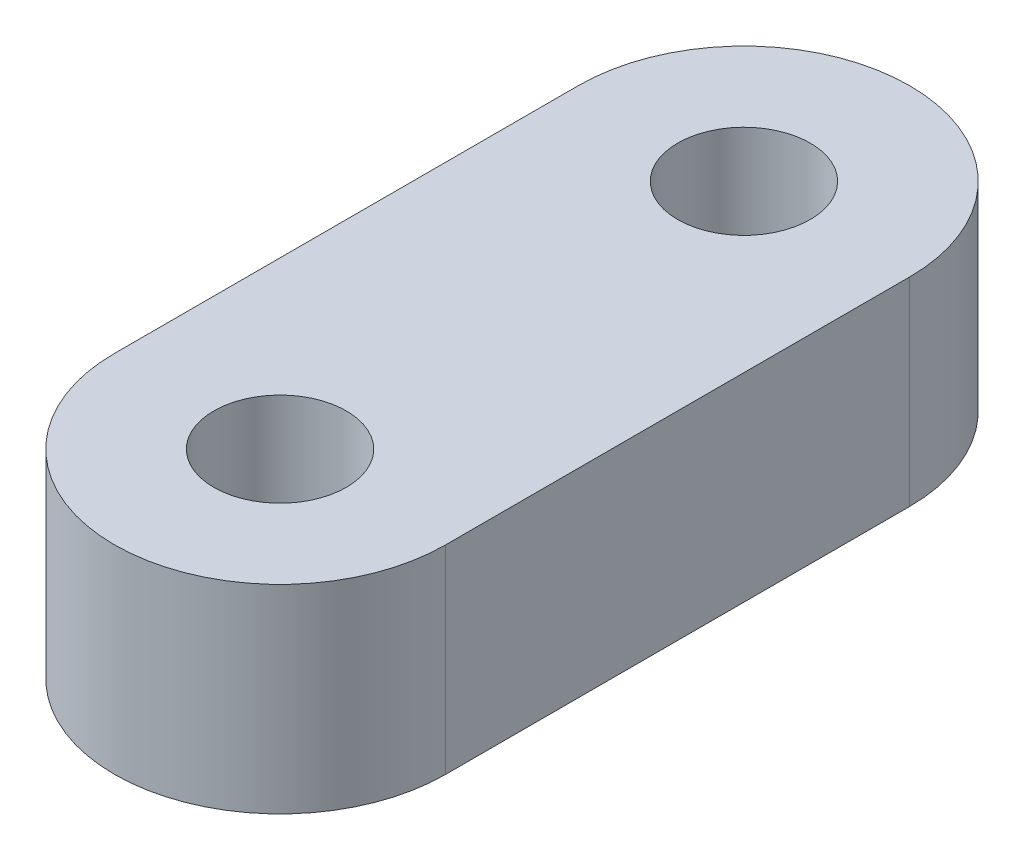
ISO-10303-21;
HEADER;
FILE_DESCRIPTION(('STEP AP214'),'2;1');
FILE_NAME('part.step','',(''),(''),'','','');
FILE_SCHEMA(('AUTOMOTIVE_DESIGN { 1 0 10303 214 1 1 1 1 }'));
ENDSEC;
DATA;
#1=APPLICATION_CONTEXT('core data for automotive mechanical design processes');
#2=APPLICATION_PROTOCOL_DEFINITION('international standard','automotive_design',2000,#1);
#3=PRODUCT_CONTEXT('',#1,'mechanical');
#4=PRODUCT('Part','Part','',(#3));
#5=PRODUCT_RELATED_PRODUCT_CATEGORY('part','',(#4));
#6=PRODUCT_DEFINITION_FORMATION('','',#4);
#7=PRODUCT_DEFINITION_CONTEXT('part definition',#1,'design');
#8=PRODUCT_DEFINITION('design','',#6,#7);
#9=PRODUCT_DEFINITION_SHAPE('','',#8);
#10=(LENGTH_UNIT() NAMED_UNIT(*) SI_UNIT(.MILLI.,.METRE.));
#11=(NAMED_UNIT(*) PLANE_ANGLE_UNIT() SI_UNIT($,.RADIAN.));
#12=(NAMED_UNIT(*) SI_UNIT($,.STERADIAN.) SOLID_ANGLE_UNIT());
#13=UNCERTAINTY_MEASURE_WITH_UNIT(LENGTH_MEASURE(1.E-05),#10,'distance_accuracy_value','');
#14=(GEOMETRIC_REPRESENTATION_CONTEXT(3) GLOBAL_UNCERTAINTY_ASSIGNED_CONTEXT((#13)) GLOBAL_UNIT_ASSIGNED_CONTEXT((#10,
#11,#12)) REPRESENTATION_CONTEXT('',''));
#15=CARTESIAN_POINT('',(0.,0.,0.));
#16=DIRECTION('',(0.,0.,1.));
#17=DIRECTION('',(1.,0.,0.));
#18=AXIS2_PLACEMENT_3D('',#15,#16,#17);
#19=CARTESIAN_POINT('',(0.,-3.,3.5));
#20=DIRECTION('',(0.,1.,0.));
#21=DIRECTION('',(0.,0.,1.));
#22=AXIS2_PLACEMENT_3D('',#19,#20,#21);
#23=CYLINDRICAL_SURFACE('',#22,2.5);
#24=CARTESIAN_POINT('',(0.,0.,3.5));
#25=DIRECTION('',(0.,1.,0.));
#26=DIRECTION('',(0.,0.,1.));
#27=AXIS2_PLACEMENT_3D('',#24,#25,#26);
#28=CIRCLE('',#27,2.5);
#29=CARTESIAN_POINT('',(-2.5,0.,3.5));
#30=VERTEX_POINT('',#29);
#31=CARTESIAN_POINT('',(2.5,0.,3.5));
#32=VERTEX_POINT('',#31);
#33=EDGE_CURVE('E102',#30,#32,#28,.T.);
#34=ORIENTED_EDGE('',*,*,#33,.F.);
#35=DIRECTION('',(0.,1.,0.));
#36=VECTOR('',#35,1.);
#37=CARTESIAN_POINT('',(-2.5,-3.,3.5));
#38=LINE('',#37,#36);
#39=CARTESIAN_POINT('',(-2.5,-3.,3.5));
#40=VERTEX_POINT('',#39);
#41=EDGE_CURVE('E11',#40,#30,#38,.T.);
#42=ORIENTED_EDGE('',*,*,#41,.F.);
#43=CARTESIAN_POINT('',(0.,-3.,3.5));
#44=DIRECTION('',(0.,1.,0.));
#45=DIRECTION('',(0.,0.,1.));
#46=AXIS2_PLACEMENT_3D('',#43,#44,#45);
#47=CIRCLE('',#46,2.5);
#48=CARTESIAN_POINT('',(2.5,-3.,3.5));
#49=VERTEX_POINT('',#48);
#50=EDGE_CURVE('E95',#40,#49,#47,.T.);
#51=ORIENTED_EDGE('',*,*,#50,.T.);
#52=DIRECTION('',(0.,1.,0.));
#53=VECTOR('',#52,1.);
#54=CARTESIAN_POINT('',(2.5,-3.,3.5));
#55=LINE('',#54,#53);
#56=EDGE_CURVE('E40',#49,#32,#55,.T.);
#57=ORIENTED_EDGE('',*,*,#56,.T.);
#58=EDGE_LOOP('',(#34,#42,#51,#57));
#59=FACE_BOUND('',#58,.T.);
#60=ADVANCED_FACE('F37',(#59),#23,.T.);
#61=CARTESIAN_POINT('',(-2.5,-3.,3.5));
#62=DIRECTION('',(-1.,0.,0.));
#63=DIRECTION('',(0.,0.,1.));
#64=AXIS2_PLACEMENT_3D('',#61,#62,#63);
#65=PLANE('',#64);
#66=DIRECTION('',(0.,0.,1.));
#67=VECTOR('',#66,1.);
#68=CARTESIAN_POINT('',(-2.5,0.,3.5));
#69=LINE('',#68,#67);
#70=CARTESIAN_POINT('',(-2.5,0.,-3.5));
#71=VERTEX_POINT('',#70);
#72=EDGE_CURVE('E97',#71,#30,#69,.T.);
#73=ORIENTED_EDGE('',*,*,#72,.F.);
#74=DIRECTION('',(0.,1.,0.));
#75=VECTOR('',#74,1.);
#76=CARTESIAN_POINT('',(-2.5,-3.,-3.5));
#77=LINE('',#76,#75);
#78=CARTESIAN_POINT('',(-2.5,-3.,-3.5));
#79=VERTEX_POINT('',#78);
#80=EDGE_CURVE('E46',#79,#71,#77,.T.);
#81=ORIENTED_EDGE('',*,*,#80,.F.);
#82=DIRECTION('',(0.,0.,1.));
#83=VECTOR('',#82,1.);
#84=CARTESIAN_POINT('',(-2.5,-3.,3.5));
#85=LINE('',#84,#83);
#86=EDGE_CURVE('E92',#79,#40,#85,.T.);
#87=ORIENTED_EDGE('',*,*,#86,.T.);
#88=ORIENTED_EDGE('',*,*,#41,.T.);
#89=EDGE_LOOP('',(#73,#81,#87,#88));
#90=FACE_BOUND('',#89,.T.);
#91=ADVANCED_FACE('F113',(#90),#65,.T.);
#92=CARTESIAN_POINT('',(0.,-3.,-3.5));
#93=DIRECTION('',(0.,1.,0.));
#94=DIRECTION('',(0.,0.,1.));
#95=AXIS2_PLACEMENT_3D('',#92,#93,#94);
#96=CYLINDRICAL_SURFACE('',#95,2.5);
#97=CARTESIAN_POINT('',(0.,0.,-3.5));
#98=DIRECTION('',(0.,1.,0.));
#99=DIRECTION('',(0.,0.,1.));
#100=AXIS2_PLACEMENT_3D('',#97,#98,#99);
#101=CIRCLE('',#100,2.5);
#102=CARTESIAN_POINT('',(2.5,0.,-3.5));
#103=VERTEX_POINT('',#102);
#104=EDGE_CURVE('E87',#103,#71,#101,.T.);
#105=ORIENTED_EDGE('',*,*,#104,.F.);
#106=DIRECTION('',(0.,1.,0.));
#107=VECTOR('',#106,1.);
#108=CARTESIAN_POINT('',(2.5,-3.,-3.5));
#109=LINE('',#108,#107);
#110=CARTESIAN_POINT('',(2.5,-3.,-3.5));
#111=VERTEX_POINT('',#110);
#112=EDGE_CURVE('E82',#111,#103,#109,.T.);
#113=ORIENTED_EDGE('',*,*,#112,.F.);
#114=CARTESIAN_POINT('',(0.,-3.,-3.5));
#115=DIRECTION('',(0.,1.,0.));
#116=DIRECTION('',(0.,0.,1.));
#117=AXIS2_PLACEMENT_3D('',#114,#115,#116);
#118=CIRCLE('',#117,2.5);
#119=EDGE_CURVE('E85',#111,#79,#118,.T.);
#120=ORIENTED_EDGE('',*,*,#119,.T.);
#121=ORIENTED_EDGE('',*,*,#80,.T.);
#122=EDGE_LOOP('',(#105,#113,#120,#121));
#123=FACE_BOUND('',#122,.T.);
#124=ADVANCED_FACE('F84',(#123),#96,.T.);
#125=CARTESIAN_POINT('',(2.5,-3.,3.5));
#126=DIRECTION('',(1.,0.,0.));
#127=DIRECTION('',(0.,0.,-1.));
#128=AXIS2_PLACEMENT_3D('',#125,#126,#127);
#129=PLANE('',#128);
#130=DIRECTION('',(0.,0.,-1.));
#131=VECTOR('',#130,1.);
#132=CARTESIAN_POINT('',(2.5,0.,3.5));
#133=LINE('',#132,#131);
#134=EDGE_CURVE('E105',#32,#103,#133,.T.);
#135=ORIENTED_EDGE('',*,*,#134,.F.);
#136=ORIENTED_EDGE('',*,*,#56,.F.);
#137=DIRECTION('',(0.,0.,-1.));
#138=VECTOR('',#137,1.);
#139=CARTESIAN_POINT('',(2.5,-3.,3.5));
#140=LINE('',#139,#138);
#141=EDGE_CURVE('E91',#49,#111,#140,.T.);
#142=ORIENTED_EDGE('',*,*,#141,.T.);
#143=ORIENTED_EDGE('',*,*,#112,.T.);
#144=EDGE_LOOP('',(#135,#136,#142,#143));
#145=FACE_BOUND('',#144,.T.);
#146=ADVANCED_FACE('F94',(#145),#129,.T.);
#147=CARTESIAN_POINT('',(0.,-3.,3.5));
#148=DIRECTION('',(0.,1.,0.));
#149=DIRECTION('',(0.,0.,1.));
#150=AXIS2_PLACEMENT_3D('',#147,#148,#149);
#151=PLANE('',#150);
#152=CARTESIAN_POINT('',(0.,-3.,3.5));
#153=DIRECTION('',(0.,1.,0.));
#154=DIRECTION('',(0.,0.,1.));
#155=AXIS2_PLACEMENT_3D('',#152,#153,#154);
#156=CIRCLE('',#155,1.);
#157=CARTESIAN_POINT('',(0.,-3.,4.5));
#158=VERTEX_POINT('',#157);
#159=EDGE_CURVE('E146',#158,#158,#156,.T.);
#160=ORIENTED_EDGE('',*,*,#159,.T.);
#161=EDGE_LOOP('',(#160));
#162=FACE_BOUND('',#161,.T.);
#163=CARTESIAN_POINT('',(0.,-3.,-3.5));
#164=DIRECTION('',(0.,1.,0.));
#165=DIRECTION('',(0.,0.,1.));
#166=AXIS2_PLACEMENT_3D('',#163,#164,#165);
#167=CIRCLE('',#166,1.);
#168=CARTESIAN_POINT('',(0.,-3.,-2.5));
#169=VERTEX_POINT('',#168);
#170=EDGE_CURVE('E106',#169,#169,#167,.T.);
#171=ORIENTED_EDGE('',*,*,#170,.T.);
#172=EDGE_LOOP('',(#171));
#173=FACE_BOUND('',#172,.T.);
#174=ORIENTED_EDGE('',*,*,#50,.F.);
#175=ORIENTED_EDGE('',*,*,#86,.F.);
#176=ORIENTED_EDGE('',*,*,#119,.F.);
#177=ORIENTED_EDGE('',*,*,#141,.F.);
#178=EDGE_LOOP('',(#174,#175,#176,#177));
#179=FACE_BOUND('',#178,.T.);
#180=ADVANCED_FACE('F90',(#162,#173,#179),#151,.F.);
#181=CARTESIAN_POINT('',(0.,0.,3.5));
#182=DIRECTION('',(0.,1.,0.));
#183=DIRECTION('',(0.,0.,1.));
#184=AXIS2_PLACEMENT_3D('',#181,#182,#183);
#185=PLANE('',#184);
#186=CARTESIAN_POINT('',(0.,0.,3.5));
#187=DIRECTION('',(0.,1.,0.));
#188=DIRECTION('',(0.,0.,1.));
#189=AXIS2_PLACEMENT_3D('',#186,#187,#188);
#190=CIRCLE('',#189,1.);
#191=CARTESIAN_POINT('',(0.,0.,4.5));
#192=VERTEX_POINT('',#191);
#193=EDGE_CURVE('E149',#192,#192,#190,.T.);
#194=ORIENTED_EDGE('',*,*,#193,.F.);
#195=EDGE_LOOP('',(#194));
#196=FACE_BOUND('',#195,.T.);
#197=CARTESIAN_POINT('',(0.,0.,-3.5));
#198=DIRECTION('',(0.,1.,0.));
#199=DIRECTION('',(0.,0.,1.));
#200=AXIS2_PLACEMENT_3D('',#197,#198,#199);
#201=CIRCLE('',#200,1.);
#202=CARTESIAN_POINT('',(0.,0.,-2.5));
#203=VERTEX_POINT('',#202);
#204=EDGE_CURVE('E151',#203,#203,#201,.T.);
#205=ORIENTED_EDGE('',*,*,#204,.F.);
#206=EDGE_LOOP('',(#205));
#207=FACE_BOUND('',#206,.T.);
#208=ORIENTED_EDGE('',*,*,#33,.T.);
#209=ORIENTED_EDGE('',*,*,#134,.T.);
#210=ORIENTED_EDGE('',*,*,#104,.T.);
#211=ORIENTED_EDGE('',*,*,#72,.T.);
#212=EDGE_LOOP('',(#208,#209,#210,#211));
#213=FACE_BOUND('',#212,.T.);
#214=ADVANCED_FACE('F112',(#196,#207,#213),#185,.T.);
#215=CARTESIAN_POINT('',(0.,-3.,-3.5));
#216=DIRECTION('',(0.,1.,0.));
#217=DIRECTION('',(0.,0.,1.));
#218=AXIS2_PLACEMENT_3D('',#215,#216,#217);
#219=CYLINDRICAL_SURFACE('',#218,1.);
#220=ORIENTED_EDGE('',*,*,#170,.F.);
#221=EDGE_LOOP('',(#220));
#222=FACE_BOUND('',#221,.T.);
#223=ORIENTED_EDGE('',*,*,#204,.T.);
#224=EDGE_LOOP('',(#223));
#225=FACE_BOUND('',#224,.T.);
#226=ADVANCED_FACE('F131',(#222,#225),#219,.F.);
#227=CARTESIAN_POINT('',(0.,-3.,3.5));
#228=DIRECTION('',(0.,1.,0.));
#229=DIRECTION('',(0.,0.,1.));
#230=AXIS2_PLACEMENT_3D('',#227,#228,#229);
#231=CYLINDRICAL_SURFACE('',#230,1.);
#232=ORIENTED_EDGE('',*,*,#159,.F.);
#233=EDGE_LOOP('',(#232));
#234=FACE_BOUND('',#233,.T.);
#235=ORIENTED_EDGE('',*,*,#193,.T.);
#236=EDGE_LOOP('',(#235));
#237=FACE_BOUND('',#236,.T.);
#238=ADVANCED_FACE('F138',(#234,#237),#231,.F.);
#239=CLOSED_SHELL('',(#60,#91,#124,#146,#180,#214,#226,#238));
#240=MANIFOLD_SOLID_BREP('B2',#239);
#241=ADVANCED_BREP_SHAPE_REPRESENTATION('',(#18,#240),#14);
#242=SHAPE_DEFINITION_REPRESENTATION(#9,#241);
ENDSEC;
END-ISO-10303-21;
